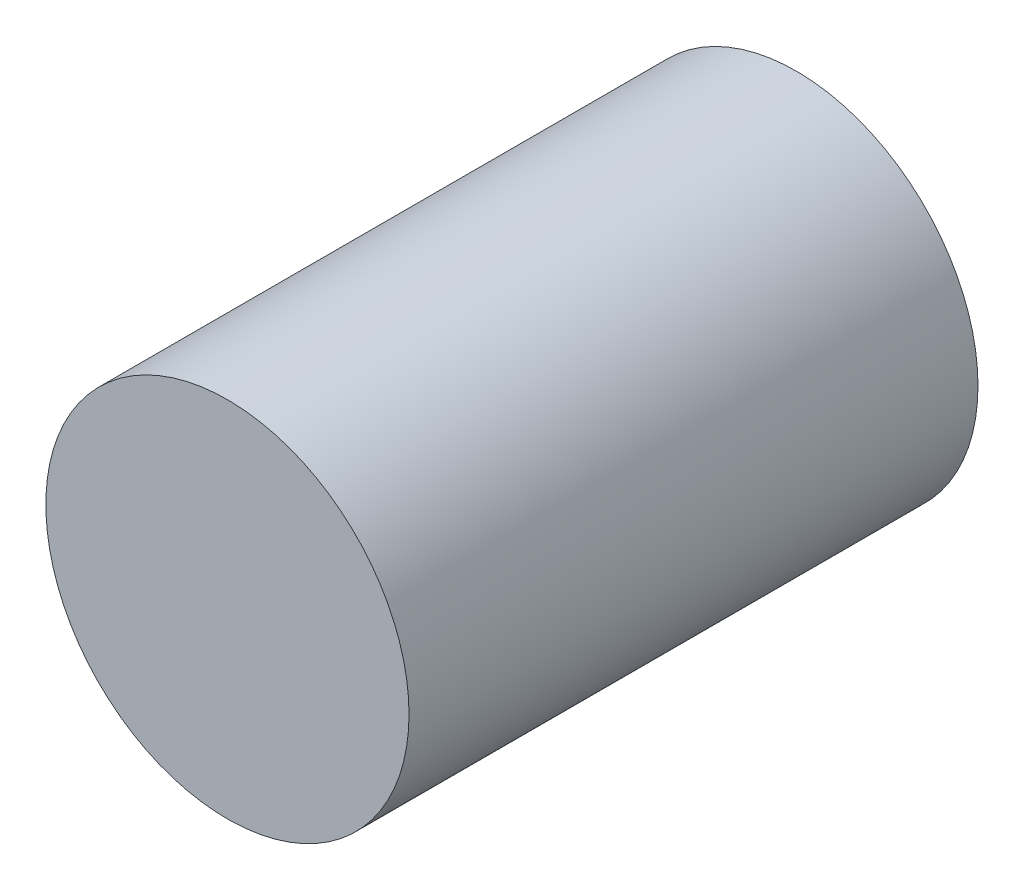
ISO-10303-21;
HEADER;
FILE_DESCRIPTION(('STEP AP214'),'2;1');
FILE_NAME('part.step','',(''),(''),'','','');
FILE_SCHEMA(('AUTOMOTIVE_DESIGN { 1 0 10303 214 1 1 1 1 }'));
ENDSEC;
DATA;
#1=APPLICATION_CONTEXT('core data for automotive mechanical design processes');
#2=APPLICATION_PROTOCOL_DEFINITION('international standard','automotive_design',2000,#1);
#3=PRODUCT_CONTEXT('',#1,'mechanical');
#4=PRODUCT('Part','Part','',(#3));
#5=PRODUCT_RELATED_PRODUCT_CATEGORY('part','',(#4));
#6=PRODUCT_DEFINITION_FORMATION('','',#4);
#7=PRODUCT_DEFINITION_CONTEXT('part definition',#1,'design');
#8=PRODUCT_DEFINITION('design','',#6,#7);
#9=PRODUCT_DEFINITION_SHAPE('','',#8);
#10=(LENGTH_UNIT() NAMED_UNIT(*) SI_UNIT(.MILLI.,.METRE.));
#11=(NAMED_UNIT(*) PLANE_ANGLE_UNIT() SI_UNIT($,.RADIAN.));
#12=(NAMED_UNIT(*) SI_UNIT($,.STERADIAN.) SOLID_ANGLE_UNIT());
#13=UNCERTAINTY_MEASURE_WITH_UNIT(LENGTH_MEASURE(1.E-05),#10,'distance_accuracy_value','');
#14=(GEOMETRIC_REPRESENTATION_CONTEXT(3) GLOBAL_UNCERTAINTY_ASSIGNED_CONTEXT((#13)) GLOBAL_UNIT_ASSIGNED_CONTEXT((#10,
#11,#12)) REPRESENTATION_CONTEXT('',''));
#15=CARTESIAN_POINT('',(0.,0.,0.));
#16=DIRECTION('',(0.,0.,1.));
#17=DIRECTION('',(1.,0.,0.));
#18=AXIS2_PLACEMENT_3D('',#15,#16,#17);
#19=CARTESIAN_POINT('',(0.,0.,23.5));
#20=DIRECTION('',(0.,0.,-1.));
#21=DIRECTION('',(-1.,0.,0.));
#22=AXIS2_PLACEMENT_3D('',#19,#20,#21);
#23=CYLINDRICAL_SURFACE('',#22,15.);
#24=CARTESIAN_POINT('',(0.,0.,23.5));
#25=DIRECTION('',(0.,0.,1.));
#26=DIRECTION('',(1.,0.,0.));
#27=AXIS2_PLACEMENT_3D('',#24,#25,#26);
#28=CIRCLE('',#27,15.);
#29=CARTESIAN_POINT('',(15.,0.,23.5));
#30=VERTEX_POINT('',#29);
#31=EDGE_CURVE('E10',#30,#30,#28,.T.);
#32=ORIENTED_EDGE('',*,*,#31,.F.);
#33=EDGE_LOOP('',(#32));
#34=FACE_BOUND('',#33,.T.);
#35=CARTESIAN_POINT('',(0.,0.,-23.5));
#36=DIRECTION('',(0.,0.,1.));
#37=DIRECTION('',(1.,0.,0.));
#38=AXIS2_PLACEMENT_3D('',#35,#36,#37);
#39=CIRCLE('',#38,15.);
#40=CARTESIAN_POINT('',(15.,0.,-23.5));
#41=VERTEX_POINT('',#40);
#42=EDGE_CURVE('E37',#41,#41,#39,.T.);
#43=ORIENTED_EDGE('',*,*,#42,.T.);
#44=EDGE_LOOP('',(#43));
#45=FACE_BOUND('',#44,.T.);
#46=ADVANCED_FACE('F40',(#34,#45),#23,.T.);
#47=CARTESIAN_POINT('',(0.,0.,23.5));
#48=DIRECTION('',(0.,0.,1.));
#49=DIRECTION('',(1.,0.,0.));
#50=AXIS2_PLACEMENT_3D('',#47,#48,#49);
#51=PLANE('',#50);
#52=ORIENTED_EDGE('',*,*,#31,.T.);
#53=EDGE_LOOP('',(#52));
#54=FACE_BOUND('',#53,.T.);
#55=ADVANCED_FACE('F76',(#54),#51,.T.);
#56=CARTESIAN_POINT('',(0.,0.,-23.5));
#57=DIRECTION('',(0.,0.,1.));
#58=DIRECTION('',(1.,0.,0.));
#59=AXIS2_PLACEMENT_3D('',#56,#57,#58);
#60=PLANE('',#59);
#61=CARTESIAN_POINT('',(8.,8.,-23.5));
#62=DIRECTION('',(0.,0.,-1.));
#63=DIRECTION('',(-1.,0.,0.));
#64=AXIS2_PLACEMENT_3D('',#61,#62,#63);
#65=CIRCLE('',#64,1.65);
#66=CARTESIAN_POINT('',(6.35,8.,-23.5));
#67=VERTEX_POINT('',#66);
#68=EDGE_CURVE('E59',#67,#67,#65,.T.);
#69=ORIENTED_EDGE('',*,*,#68,.F.);
#70=EDGE_LOOP('',(#69));
#71=FACE_BOUND('',#70,.T.);
#72=CARTESIAN_POINT('',(8.,-8.,-23.5));
#73=DIRECTION('',(0.,0.,-1.));
#74=DIRECTION('',(-1.,0.,0.));
#75=AXIS2_PLACEMENT_3D('',#72,#73,#74);
#76=CIRCLE('',#75,1.65);
#77=CARTESIAN_POINT('',(6.35,-8.,-23.5));
#78=VERTEX_POINT('',#77);
#79=EDGE_CURVE('E61',#78,#78,#76,.T.);
#80=ORIENTED_EDGE('',*,*,#79,.F.);
#81=EDGE_LOOP('',(#80));
#82=FACE_BOUND('',#81,.T.);
#83=CARTESIAN_POINT('',(-8.,-8.,-23.5));
#84=DIRECTION('',(0.,0.,-1.));
#85=DIRECTION('',(-1.,0.,0.));
#86=AXIS2_PLACEMENT_3D('',#83,#84,#85);
#87=CIRCLE('',#86,1.65);
#88=CARTESIAN_POINT('',(-9.65,-8.,-23.5));
#89=VERTEX_POINT('',#88);
#90=EDGE_CURVE('E55',#89,#89,#87,.T.);
#91=ORIENTED_EDGE('',*,*,#90,.F.);
#92=EDGE_LOOP('',(#91));
#93=FACE_BOUND('',#92,.T.);
#94=CARTESIAN_POINT('',(-8.,8.,-23.5));
#95=DIRECTION('',(0.,0.,-1.));
#96=DIRECTION('',(-1.,0.,0.));
#97=AXIS2_PLACEMENT_3D('',#94,#95,#96);
#98=CIRCLE('',#97,1.65);
#99=CARTESIAN_POINT('',(-9.65,8.,-23.5));
#100=VERTEX_POINT('',#99);
#101=EDGE_CURVE('E47',#100,#100,#98,.T.);
#102=ORIENTED_EDGE('',*,*,#101,.F.);
#103=EDGE_LOOP('',(#102));
#104=FACE_BOUND('',#103,.T.);
#105=ORIENTED_EDGE('',*,*,#42,.F.);
#106=EDGE_LOOP('',(#105));
#107=FACE_BOUND('',#106,.T.);
#108=ADVANCED_FACE('F73',(#71,#82,#93,#104,#107),#60,.F.);
#109=CARTESIAN_POINT('',(-8.,8.,-13.5));
#110=DIRECTION('',(0.,0.,-1.));
#111=DIRECTION('',(-1.,0.,0.));
#112=AXIS2_PLACEMENT_3D('',#109,#110,#111);
#113=CYLINDRICAL_SURFACE('',#112,1.65);
#114=CARTESIAN_POINT('',(-8.,8.,-13.5));
#115=DIRECTION('',(0.,0.,-1.));
#116=DIRECTION('',(-1.,0.,0.));
#117=AXIS2_PLACEMENT_3D('',#114,#115,#116);
#118=CIRCLE('',#117,1.65);
#119=CARTESIAN_POINT('',(-9.65,8.,-13.5));
#120=VERTEX_POINT('',#119);
#121=EDGE_CURVE('E50',#120,#120,#118,.T.);
#122=ORIENTED_EDGE('',*,*,#121,.F.);
#123=EDGE_LOOP('',(#122));
#124=FACE_BOUND('',#123,.T.);
#125=ORIENTED_EDGE('',*,*,#101,.T.);
#126=EDGE_LOOP('',(#125));
#127=FACE_BOUND('',#126,.T.);
#128=ADVANCED_FACE('F79',(#124,#127),#113,.F.);
#129=CARTESIAN_POINT('',(0.,0.,-13.5));
#130=DIRECTION('',(0.,0.,-1.));
#131=DIRECTION('',(-1.,0.,0.));
#132=AXIS2_PLACEMENT_3D('',#129,#130,#131);
#133=PLANE('',#132);
#134=ORIENTED_EDGE('',*,*,#121,.T.);
#135=EDGE_LOOP('',(#134));
#136=FACE_BOUND('',#135,.T.);
#137=ADVANCED_FACE('F96',(#136),#133,.T.);
#138=CARTESIAN_POINT('',(-8.,-8.,-13.5));
#139=DIRECTION('',(0.,0.,-1.));
#140=DIRECTION('',(-1.,0.,0.));
#141=AXIS2_PLACEMENT_3D('',#138,#139,#140);
#142=CYLINDRICAL_SURFACE('',#141,1.65);
#143=CARTESIAN_POINT('',(-8.,-8.,-13.5));
#144=DIRECTION('',(0.,0.,-1.));
#145=DIRECTION('',(-1.,0.,0.));
#146=AXIS2_PLACEMENT_3D('',#143,#144,#145);
#147=CIRCLE('',#146,1.65);
#148=CARTESIAN_POINT('',(-9.65,-8.,-13.5));
#149=VERTEX_POINT('',#148);
#150=EDGE_CURVE('E70',#149,#149,#147,.T.);
#151=ORIENTED_EDGE('',*,*,#150,.F.);
#152=EDGE_LOOP('',(#151));
#153=FACE_BOUND('',#152,.T.);
#154=ORIENTED_EDGE('',*,*,#90,.T.);
#155=EDGE_LOOP('',(#154));
#156=FACE_BOUND('',#155,.T.);
#157=ADVANCED_FACE('F71',(#153,#156),#142,.F.);
#158=CARTESIAN_POINT('',(0.,0.,-13.5));
#159=DIRECTION('',(0.,0.,-1.));
#160=DIRECTION('',(-1.,0.,0.));
#161=AXIS2_PLACEMENT_3D('',#158,#159,#160);
#162=PLANE('',#161);
#163=ORIENTED_EDGE('',*,*,#150,.T.);
#164=EDGE_LOOP('',(#163));
#165=FACE_BOUND('',#164,.T.);
#166=ADVANCED_FACE('F117',(#165),#162,.T.);
#167=CARTESIAN_POINT('',(8.,-8.,-13.5));
#168=DIRECTION('',(0.,0.,-1.));
#169=DIRECTION('',(-1.,0.,0.));
#170=AXIS2_PLACEMENT_3D('',#167,#168,#169);
#171=CYLINDRICAL_SURFACE('',#170,1.65);
#172=CARTESIAN_POINT('',(8.,-8.,-13.5));
#173=DIRECTION('',(0.,0.,-1.));
#174=DIRECTION('',(-1.,0.,0.));
#175=AXIS2_PLACEMENT_3D('',#172,#173,#174);
#176=CIRCLE('',#175,1.65);
#177=CARTESIAN_POINT('',(6.35,-8.,-13.5));
#178=VERTEX_POINT('',#177);
#179=EDGE_CURVE('E62',#178,#178,#176,.T.);
#180=ORIENTED_EDGE('',*,*,#179,.F.);
#181=EDGE_LOOP('',(#180));
#182=FACE_BOUND('',#181,.T.);
#183=ORIENTED_EDGE('',*,*,#79,.T.);
#184=EDGE_LOOP('',(#183));
#185=FACE_BOUND('',#184,.T.);
#186=ADVANCED_FACE('F115',(#182,#185),#171,.F.);
#187=CARTESIAN_POINT('',(0.,0.,-13.5));
#188=DIRECTION('',(0.,0.,-1.));
#189=DIRECTION('',(-1.,0.,0.));
#190=AXIS2_PLACEMENT_3D('',#187,#188,#189);
#191=PLANE('',#190);
#192=ORIENTED_EDGE('',*,*,#179,.T.);
#193=EDGE_LOOP('',(#192));
#194=FACE_BOUND('',#193,.T.);
#195=ADVANCED_FACE('F107',(#194),#191,.T.);
#196=CARTESIAN_POINT('',(8.,8.,-13.5));
#197=DIRECTION('',(0.,0.,-1.));
#198=DIRECTION('',(-1.,0.,0.));
#199=AXIS2_PLACEMENT_3D('',#196,#197,#198);
#200=CYLINDRICAL_SURFACE('',#199,1.65);
#201=CARTESIAN_POINT('',(8.,8.,-13.5));
#202=DIRECTION('',(0.,0.,-1.));
#203=DIRECTION('',(-1.,0.,0.));
#204=AXIS2_PLACEMENT_3D('',#201,#202,#203);
#205=CIRCLE('',#204,1.65);
#206=CARTESIAN_POINT('',(6.35,8.,-13.5));
#207=VERTEX_POINT('',#206);
#208=EDGE_CURVE('E54',#207,#207,#205,.T.);
#209=ORIENTED_EDGE('',*,*,#208,.F.);
#210=EDGE_LOOP('',(#209));
#211=FACE_BOUND('',#210,.T.);
#212=ORIENTED_EDGE('',*,*,#68,.T.);
#213=EDGE_LOOP('',(#212));
#214=FACE_BOUND('',#213,.T.);
#215=ADVANCED_FACE('F102',(#211,#214),#200,.F.);
#216=CARTESIAN_POINT('',(8.,8.,-13.5));
#217=DIRECTION('',(0.,0.,-1.));
#218=DIRECTION('',(-1.,0.,0.));
#219=AXIS2_PLACEMENT_3D('',#216,#217,#218);
#220=PLANE('',#219);
#221=ORIENTED_EDGE('',*,*,#208,.T.);
#222=EDGE_LOOP('',(#221));
#223=FACE_BOUND('',#222,.T.);
#224=ADVANCED_FACE('F101',(#223),#220,.T.);
#225=CLOSED_SHELL('',(#46,#55,#108,#128,#137,#157,#166,#186,#195,#215,#224));
#226=MANIFOLD_SOLID_BREP('B2',#225);
#227=ADVANCED_BREP_SHAPE_REPRESENTATION('',(#18,#226),#14);
#228=SHAPE_DEFINITION_REPRESENTATION(#9,#227);
ENDSEC;
END-ISO-10303-21;
